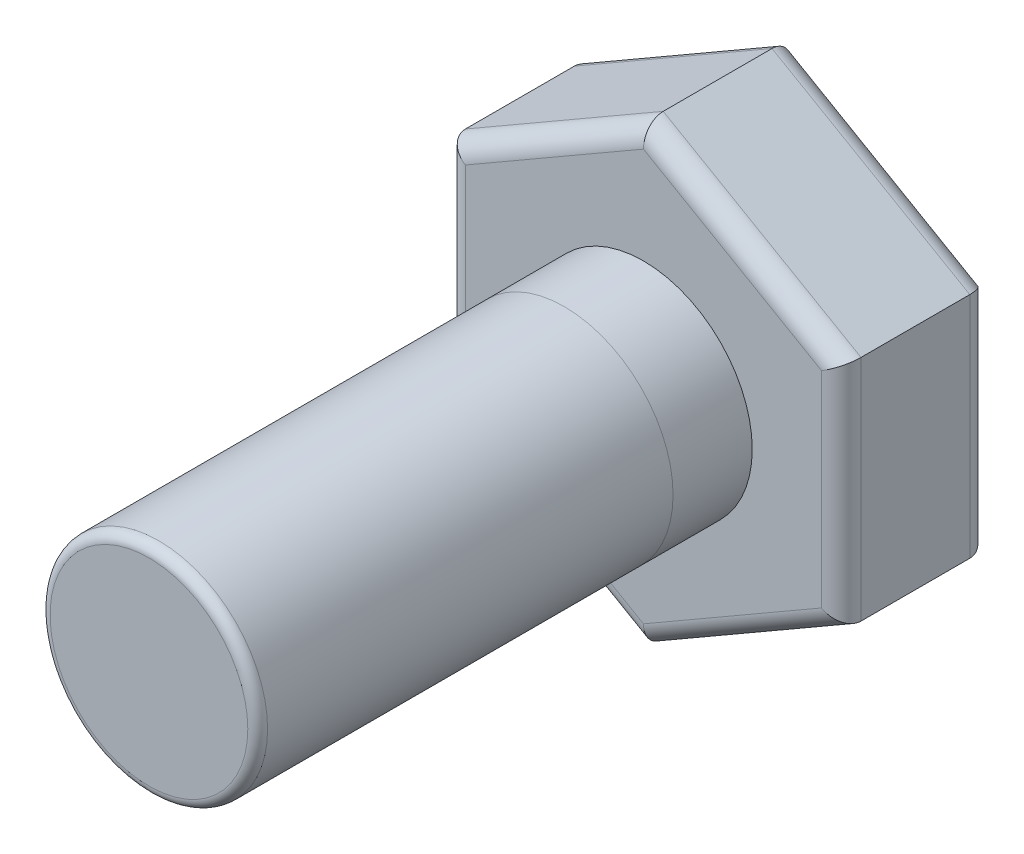
ISO-10303-21;
HEADER;
FILE_DESCRIPTION(('STEP AP214'),'2;1');
FILE_NAME('part.step','',(''),(''),'','','');
FILE_SCHEMA(('AUTOMOTIVE_DESIGN { 1 0 10303 214 1 1 1 1 }'));
ENDSEC;
DATA;
#1=APPLICATION_CONTEXT('core data for automotive mechanical design processes');
#2=APPLICATION_PROTOCOL_DEFINITION('international standard','automotive_design',2000,#1);
#3=PRODUCT_CONTEXT('',#1,'mechanical');
#4=PRODUCT('Part','Part','',(#3));
#5=PRODUCT_RELATED_PRODUCT_CATEGORY('part','',(#4));
#6=PRODUCT_DEFINITION_FORMATION('','',#4);
#7=PRODUCT_DEFINITION_CONTEXT('part definition',#1,'design');
#8=PRODUCT_DEFINITION('design','',#6,#7);
#9=PRODUCT_DEFINITION_SHAPE('','',#8);
#10=(LENGTH_UNIT() NAMED_UNIT(*) SI_UNIT(.MILLI.,.METRE.));
#11=(NAMED_UNIT(*) PLANE_ANGLE_UNIT() SI_UNIT($,.RADIAN.));
#12=(NAMED_UNIT(*) SI_UNIT($,.STERADIAN.) SOLID_ANGLE_UNIT());
#13=UNCERTAINTY_MEASURE_WITH_UNIT(LENGTH_MEASURE(1.E-05),#10,'distance_accuracy_value','');
#14=(GEOMETRIC_REPRESENTATION_CONTEXT(3) GLOBAL_UNCERTAINTY_ASSIGNED_CONTEXT((#13)) GLOBAL_UNIT_ASSIGNED_CONTEXT((#10,
#11,#12)) REPRESENTATION_CONTEXT('',''));
#15=CARTESIAN_POINT('',(0.,0.,0.));
#16=DIRECTION('',(0.,0.,1.));
#17=DIRECTION('',(1.,0.,0.));
#18=AXIS2_PLACEMENT_3D('',#15,#16,#17);
#19=CARTESIAN_POINT('',(20.,34.6410161513775,15.));
#20=DIRECTION('',(0.,0.,1.));
#21=DIRECTION('',(1.,0.,0.));
#22=AXIS2_PLACEMENT_3D('',#19,#20,#21);
#23=PLANE('',#22);
#24=DIRECTION('',(0.,-1.,0.));
#25=VECTOR('',#24,1.);
#26=CARTESIAN_POINT('',(-18.,-11.5470053837925,15.));
#27=LINE('',#26,#25);
#28=CARTESIAN_POINT('',(-18.,10.3923048454133,15.));
#29=VERTEX_POINT('',#28);
#30=CARTESIAN_POINT('',(-18.,-10.3923048454133,15.));
#31=VERTEX_POINT('',#30);
#32=EDGE_CURVE('E58',#29,#31,#27,.T.);
#33=ORIENTED_EDGE('',*,*,#32,.T.);
#34=DIRECTION('',(0.866025403784439,-0.5,0.));
#35=VECTOR('',#34,1.);
#36=CARTESIAN_POINT('',(1.,-21.3619599600162,15.));
#37=LINE('',#36,#35);
#38=CARTESIAN_POINT('',(0.,-20.7846096908265,15.));
#39=VERTEX_POINT('',#38);
#40=EDGE_CURVE('E416',#31,#39,#37,.T.);
#41=ORIENTED_EDGE('',*,*,#40,.T.);
#42=DIRECTION('',(0.866025403784439,0.5,0.));
#43=VECTOR('',#42,1.);
#44=CARTESIAN_POINT('',(19.,-9.81495457622365,15.));
#45=LINE('',#44,#43);
#46=CARTESIAN_POINT('',(18.,-10.3923048454133,15.));
#47=VERTEX_POINT('',#46);
#48=EDGE_CURVE('E417',#39,#47,#45,.T.);
#49=ORIENTED_EDGE('',*,*,#48,.T.);
#50=DIRECTION('',(0.,1.,0.));
#51=VECTOR('',#50,1.);
#52=CARTESIAN_POINT('',(18.,11.5470053837925,15.));
#53=LINE('',#52,#51);
#54=CARTESIAN_POINT('',(18.,10.3923048454133,15.));
#55=VERTEX_POINT('',#54);
#56=EDGE_CURVE('E448',#47,#55,#53,.T.);
#57=ORIENTED_EDGE('',*,*,#56,.T.);
#58=DIRECTION('',(-0.866025403784439,0.5,0.));
#59=VECTOR('',#58,1.);
#60=CARTESIAN_POINT('',(-0.999999999999994,21.3619599600162,15.));
#61=LINE('',#60,#59);
#62=CARTESIAN_POINT('',(0.,20.7846096908265,15.));
#63=VERTEX_POINT('',#62);
#64=EDGE_CURVE('E444',#55,#63,#61,.T.);
#65=ORIENTED_EDGE('',*,*,#64,.T.);
#66=DIRECTION('',(-0.866025403784439,-0.5,0.));
#67=VECTOR('',#66,1.);
#68=CARTESIAN_POINT('',(-19.,9.81495457622364,15.));
#69=LINE('',#68,#67);
#70=EDGE_CURVE('E164',#63,#29,#69,.T.);
#71=ORIENTED_EDGE('',*,*,#70,.T.);
#72=EDGE_LOOP('',(#33,#41,#49,#57,#65,#71));
#73=FACE_BOUND('',#72,.T.);
#74=CARTESIAN_POINT('',(0.,0.,15.));
#75=DIRECTION('',(0.,0.,1.));
#76=DIRECTION('',(1.,0.,0.));
#77=AXIS2_PLACEMENT_3D('',#74,#75,#76);
#78=CIRCLE('',#77,11.);
#79=CARTESIAN_POINT('',(11.,0.,15.));
#80=VERTEX_POINT('',#79);
#81=EDGE_CURVE('E435',#80,#80,#78,.T.);
#82=ORIENTED_EDGE('',*,*,#81,.F.);
#83=EDGE_LOOP('',(#82));
#84=FACE_BOUND('',#83,.T.);
#85=ADVANCED_FACE('F35',(#73,#84),#23,.T.);
#86=CARTESIAN_POINT('',(20.,-11.5470053837925,15.));
#87=DIRECTION('',(-1.,0.,0.));
#88=DIRECTION('',(0.,0.,1.));
#89=AXIS2_PLACEMENT_3D('',#86,#87,#88);
#90=PLANE('',#89);
#91=DIRECTION('',(0.,0.,-1.));
#92=VECTOR('',#91,1.);
#93=CARTESIAN_POINT('',(20.,-11.5470053837925,15.));
#94=LINE('',#93,#92);
#95=CARTESIAN_POINT('',(20.,-11.5470053837925,13.));
#96=VERTEX_POINT('',#95);
#97=CARTESIAN_POINT('',(20.,-11.5470053837925,2.));
#98=VERTEX_POINT('',#97);
#99=EDGE_CURVE('E487',#96,#98,#94,.T.);
#100=ORIENTED_EDGE('',*,*,#99,.T.);
#101=DIRECTION('',(0.,1.,0.));
#102=VECTOR('',#101,1.);
#103=CARTESIAN_POINT('',(20.,-11.5470053837925,2.));
#104=LINE('',#103,#102);
#105=CARTESIAN_POINT('',(20.,11.5470053837925,2.));
#106=VERTEX_POINT('',#105);
#107=EDGE_CURVE('E450',#98,#106,#104,.T.);
#108=ORIENTED_EDGE('',*,*,#107,.T.);
#109=DIRECTION('',(0.,0.,-1.));
#110=VECTOR('',#109,1.);
#111=CARTESIAN_POINT('',(20.,11.5470053837925,15.));
#112=LINE('',#111,#110);
#113=CARTESIAN_POINT('',(20.,11.5470053837925,13.));
#114=VERTEX_POINT('',#113);
#115=EDGE_CURVE('E150',#114,#106,#112,.T.);
#116=ORIENTED_EDGE('',*,*,#115,.F.);
#117=DIRECTION('',(0.,1.,0.));
#118=VECTOR('',#117,1.);
#119=CARTESIAN_POINT('',(20.,-11.5470053837925,13.));
#120=LINE('',#119,#118);
#121=EDGE_CURVE('E452',#114,#96,#120,.F.);
#122=ORIENTED_EDGE('',*,*,#121,.T.);
#123=EDGE_LOOP('',(#100,#108,#116,#122));
#124=FACE_BOUND('',#123,.T.);
#125=ADVANCED_FACE('F198',(#124),#90,.F.);
#126=CARTESIAN_POINT('',(20.,11.5470053837925,15.));
#127=DIRECTION('',(-0.5,-0.866025403784439,0.));
#128=DIRECTION('',(0.866025403784439,-0.5,0.));
#129=AXIS2_PLACEMENT_3D('',#126,#127,#128);
#130=PLANE('',#129);
#131=ORIENTED_EDGE('',*,*,#115,.T.);
#132=DIRECTION('',(-0.866025403784439,0.5,0.));
#133=VECTOR('',#132,1.);
#134=CARTESIAN_POINT('',(20.,11.5470053837925,2.));
#135=LINE('',#134,#133);
#136=CARTESIAN_POINT('',(0.,23.094010767585,2.));
#137=VERTEX_POINT('',#136);
#138=EDGE_CURVE('E149',#106,#137,#135,.T.);
#139=ORIENTED_EDGE('',*,*,#138,.T.);
#140=DIRECTION('',(0.,0.,-1.));
#141=VECTOR('',#140,1.);
#142=CARTESIAN_POINT('',(0.,23.094010767585,15.));
#143=LINE('',#142,#141);
#144=CARTESIAN_POINT('',(0.,23.094010767585,13.));
#145=VERTEX_POINT('',#144);
#146=EDGE_CURVE('E131',#145,#137,#143,.T.);
#147=ORIENTED_EDGE('',*,*,#146,.F.);
#148=DIRECTION('',(-0.866025403784439,0.5,0.));
#149=VECTOR('',#148,1.);
#150=CARTESIAN_POINT('',(20.,11.5470053837925,13.));
#151=LINE('',#150,#149);
#152=EDGE_CURVE('E146',#145,#114,#151,.F.);
#153=ORIENTED_EDGE('',*,*,#152,.T.);
#154=EDGE_LOOP('',(#131,#139,#147,#153));
#155=FACE_BOUND('',#154,.T.);
#156=ADVANCED_FACE('F145',(#155),#130,.F.);
#157=CARTESIAN_POINT('',(0.,23.094010767585,15.));
#158=DIRECTION('',(0.5,-0.866025403784439,0.));
#159=DIRECTION('',(0.866025403784439,0.5,0.));
#160=AXIS2_PLACEMENT_3D('',#157,#158,#159);
#161=PLANE('',#160);
#162=ORIENTED_EDGE('',*,*,#146,.T.);
#163=DIRECTION('',(-0.866025403784439,-0.5,0.));
#164=VECTOR('',#163,1.);
#165=CARTESIAN_POINT('',(0.,23.094010767585,2.));
#166=LINE('',#165,#164);
#167=CARTESIAN_POINT('',(-20.,11.5470053837925,2.));
#168=VERTEX_POINT('',#167);
#169=EDGE_CURVE('E138',#137,#168,#166,.T.);
#170=ORIENTED_EDGE('',*,*,#169,.T.);
#171=DIRECTION('',(0.,0.,-1.));
#172=VECTOR('',#171,1.);
#173=CARTESIAN_POINT('',(-20.,11.5470053837925,15.));
#174=LINE('',#173,#172);
#175=CARTESIAN_POINT('',(-20.,11.5470053837925,13.));
#176=VERTEX_POINT('',#175);
#177=EDGE_CURVE('E133',#176,#168,#174,.T.);
#178=ORIENTED_EDGE('',*,*,#177,.F.);
#179=DIRECTION('',(-0.866025403784439,-0.5,0.));
#180=VECTOR('',#179,1.);
#181=CARTESIAN_POINT('',(0.,23.094010767585,13.));
#182=LINE('',#181,#180);
#183=EDGE_CURVE('E128',#176,#145,#182,.F.);
#184=ORIENTED_EDGE('',*,*,#183,.T.);
#185=EDGE_LOOP('',(#162,#170,#178,#184));
#186=FACE_BOUND('',#185,.T.);
#187=ADVANCED_FACE('F130',(#186),#161,.F.);
#188=CARTESIAN_POINT('',(-20.,11.5470053837925,15.));
#189=DIRECTION('',(1.,0.,0.));
#190=DIRECTION('',(0.,0.,-1.));
#191=AXIS2_PLACEMENT_3D('',#188,#189,#190);
#192=PLANE('',#191);
#193=ORIENTED_EDGE('',*,*,#177,.T.);
#194=DIRECTION('',(0.,-1.,0.));
#195=VECTOR('',#194,1.);
#196=CARTESIAN_POINT('',(-20.,11.5470053837925,2.));
#197=LINE('',#196,#195);
#198=CARTESIAN_POINT('',(-20.,-11.5470053837925,2.));
#199=VERTEX_POINT('',#198);
#200=EDGE_CURVE('E462',#168,#199,#197,.T.);
#201=ORIENTED_EDGE('',*,*,#200,.T.);
#202=DIRECTION('',(0.,0.,-1.));
#203=VECTOR('',#202,1.);
#204=CARTESIAN_POINT('',(-20.,-11.5470053837925,15.));
#205=LINE('',#204,#203);
#206=CARTESIAN_POINT('',(-20.,-11.5470053837925,13.));
#207=VERTEX_POINT('',#206);
#208=EDGE_CURVE('E481',#207,#199,#205,.T.);
#209=ORIENTED_EDGE('',*,*,#208,.F.);
#210=DIRECTION('',(0.,-1.,0.));
#211=VECTOR('',#210,1.);
#212=CARTESIAN_POINT('',(-20.,11.5470053837925,13.));
#213=LINE('',#212,#211);
#214=EDGE_CURVE('E442',#207,#176,#213,.F.);
#215=ORIENTED_EDGE('',*,*,#214,.T.);
#216=EDGE_LOOP('',(#193,#201,#209,#215));
#217=FACE_BOUND('',#216,.T.);
#218=ADVANCED_FACE('F209',(#217),#192,.F.);
#219=CARTESIAN_POINT('',(-20.,-11.5470053837925,15.));
#220=DIRECTION('',(0.5,0.866025403784439,0.));
#221=DIRECTION('',(-0.866025403784439,0.5,0.));
#222=AXIS2_PLACEMENT_3D('',#219,#220,#221);
#223=PLANE('',#222);
#224=ORIENTED_EDGE('',*,*,#208,.T.);
#225=DIRECTION('',(0.866025403784439,-0.5,0.));
#226=VECTOR('',#225,1.);
#227=CARTESIAN_POINT('',(-20.,-11.5470053837925,2.));
#228=LINE('',#227,#226);
#229=CARTESIAN_POINT('',(0.,-23.094010767585,2.));
#230=VERTEX_POINT('',#229);
#231=EDGE_CURVE('E458',#199,#230,#228,.T.);
#232=ORIENTED_EDGE('',*,*,#231,.T.);
#233=DIRECTION('',(0.,0.,-1.));
#234=VECTOR('',#233,1.);
#235=CARTESIAN_POINT('',(0.,-23.094010767585,15.));
#236=LINE('',#235,#234);
#237=CARTESIAN_POINT('',(0.,-23.094010767585,13.));
#238=VERTEX_POINT('',#237);
#239=EDGE_CURVE('E484',#238,#230,#236,.T.);
#240=ORIENTED_EDGE('',*,*,#239,.F.);
#241=DIRECTION('',(0.866025403784439,-0.5,0.));
#242=VECTOR('',#241,1.);
#243=CARTESIAN_POINT('',(-20.,-11.5470053837925,13.));
#244=LINE('',#243,#242);
#245=EDGE_CURVE('E460',#238,#207,#244,.F.);
#246=ORIENTED_EDGE('',*,*,#245,.T.);
#247=EDGE_LOOP('',(#224,#232,#240,#246));
#248=FACE_BOUND('',#247,.T.);
#249=ADVANCED_FACE('F205',(#248),#223,.F.);
#250=CARTESIAN_POINT('',(0.,-23.094010767585,15.));
#251=DIRECTION('',(-0.5,0.866025403784439,0.));
#252=DIRECTION('',(-0.866025403784439,-0.5,0.));
#253=AXIS2_PLACEMENT_3D('',#250,#251,#252);
#254=PLANE('',#253);
#255=ORIENTED_EDGE('',*,*,#239,.T.);
#256=DIRECTION('',(0.866025403784439,0.5,0.));
#257=VECTOR('',#256,1.);
#258=CARTESIAN_POINT('',(0.,-23.094010767585,2.));
#259=LINE('',#258,#257);
#260=EDGE_CURVE('E454',#230,#98,#259,.T.);
#261=ORIENTED_EDGE('',*,*,#260,.T.);
#262=ORIENTED_EDGE('',*,*,#99,.F.);
#263=DIRECTION('',(0.866025403784439,0.5,0.));
#264=VECTOR('',#263,1.);
#265=CARTESIAN_POINT('',(0.,-23.094010767585,13.));
#266=LINE('',#265,#264);
#267=EDGE_CURVE('E456',#96,#238,#266,.F.);
#268=ORIENTED_EDGE('',*,*,#267,.T.);
#269=EDGE_LOOP('',(#255,#261,#262,#268));
#270=FACE_BOUND('',#269,.T.);
#271=ADVANCED_FACE('F201',(#270),#254,.F.);
#272=CARTESIAN_POINT('',(20.,34.6410161513775,0.));
#273=DIRECTION('',(0.,0.,1.));
#274=DIRECTION('',(1.,0.,0.));
#275=AXIS2_PLACEMENT_3D('',#272,#273,#274);
#276=PLANE('',#275);
#277=DIRECTION('',(-0.866025403784439,-0.5,0.));
#278=VECTOR('',#277,1.);
#279=CARTESIAN_POINT('',(21.,32.9089653438087,0.));
#280=LINE('',#279,#278);
#281=CARTESIAN_POINT('',(-18.,10.3923048454133,0.));
#282=VERTEX_POINT('',#281);
#283=CARTESIAN_POINT('',(0.,20.7846096908265,0.));
#284=VERTEX_POINT('',#283);
#285=EDGE_CURVE('E468',#282,#284,#280,.F.);
#286=ORIENTED_EDGE('',*,*,#285,.T.);
#287=DIRECTION('',(-0.866025403784439,0.5,0.));
#288=VECTOR('',#287,1.);
#289=CARTESIAN_POINT('',(9.00000000000001,15.5884572681199,0.));
#290=LINE('',#289,#288);
#291=CARTESIAN_POINT('',(18.,10.3923048454133,0.));
#292=VERTEX_POINT('',#291);
#293=EDGE_CURVE('E139',#284,#292,#290,.F.);
#294=ORIENTED_EDGE('',*,*,#293,.T.);
#295=DIRECTION('',(0.,1.,0.));
#296=VECTOR('',#295,1.);
#297=CARTESIAN_POINT('',(18.,34.6410161513775,0.));
#298=LINE('',#297,#296);
#299=CARTESIAN_POINT('',(18.,-10.3923048454133,0.));
#300=VERTEX_POINT('',#299);
#301=EDGE_CURVE('E476',#292,#300,#298,.F.);
#302=ORIENTED_EDGE('',*,*,#301,.T.);
#303=DIRECTION('',(0.866025403784439,0.5,0.));
#304=VECTOR('',#303,1.);
#305=CARTESIAN_POINT('',(39.,1.73205080756886,0.));
#306=LINE('',#305,#304);
#307=CARTESIAN_POINT('',(0.,-20.7846096908265,0.));
#308=VERTEX_POINT('',#307);
#309=EDGE_CURVE('E474',#300,#308,#306,.F.);
#310=ORIENTED_EDGE('',*,*,#309,.T.);
#311=DIRECTION('',(0.866025403784439,-0.5,0.));
#312=VECTOR('',#311,1.);
#313=CARTESIAN_POINT('',(-9.,-15.5884572681199,0.));
#314=LINE('',#313,#312);
#315=CARTESIAN_POINT('',(-18.,-10.3923048454133,0.));
#316=VERTEX_POINT('',#315);
#317=EDGE_CURVE('E472',#308,#316,#314,.F.);
#318=ORIENTED_EDGE('',*,*,#317,.T.);
#319=DIRECTION('',(0.,-1.,0.));
#320=VECTOR('',#319,1.);
#321=CARTESIAN_POINT('',(-18.,34.6410161513775,0.));
#322=LINE('',#321,#320);
#323=EDGE_CURVE('E470',#316,#282,#322,.F.);
#324=ORIENTED_EDGE('',*,*,#323,.T.);
#325=EDGE_LOOP('',(#286,#294,#302,#310,#318,#324));
#326=FACE_BOUND('',#325,.T.);
#327=ADVANCED_FACE('F192',(#326),#276,.F.);
#328=CARTESIAN_POINT('',(0.,0.,23.));
#329=DIRECTION('',(0.,0.,-1.));
#330=DIRECTION('',(-1.,0.,0.));
#331=AXIS2_PLACEMENT_3D('',#328,#329,#330);
#332=CYLINDRICAL_SURFACE('',#331,11.);
#333=CARTESIAN_POINT('',(0.,0.,23.));
#334=DIRECTION('',(0.,0.,1.));
#335=DIRECTION('',(1.,0.,0.));
#336=AXIS2_PLACEMENT_3D('',#333,#334,#335);
#337=CIRCLE('',#336,10.995);
#338=CARTESIAN_POINT('',(10.995,0.,23.));
#339=VERTEX_POINT('',#338);
#340=EDGE_CURVE('E177',#339,#339,#337,.T.);
#341=ORIENTED_EDGE('',*,*,#340,.F.);
#342=EDGE_LOOP('',(#341));
#343=FACE_BOUND('',#342,.T.);
#344=ORIENTED_EDGE('',*,*,#81,.T.);
#345=EDGE_LOOP('',(#344));
#346=FACE_BOUND('',#345,.T.);
#347=ADVANCED_FACE('F181',(#343,#346),#332,.T.);
#348=CARTESIAN_POINT('',(-19.,-9.81495457622364,2.));
#349=DIRECTION('',(0.866025403784439,-0.5,0.));
#350=DIRECTION('',(0.5,0.866025403784439,0.));
#351=AXIS2_PLACEMENT_3D('',#348,#349,#350);
#352=CYLINDRICAL_SURFACE('',#351,2.);
#353=CARTESIAN_POINT('',(-18.,-10.3923048454133,2.));
#354=DIRECTION('',(0.5,-0.866025403784439,0.));
#355=DIRECTION('',(0.866025403784439,0.5,0.));
#356=AXIS2_PLACEMENT_3D('',#353,#354,#355);
#357=ELLIPSE('',#356,2.3094010767585,2.);
#358=EDGE_CURVE('E429',#316,#199,#357,.F.);
#359=ORIENTED_EDGE('',*,*,#358,.F.);
#360=ORIENTED_EDGE('',*,*,#317,.F.);
#361=CARTESIAN_POINT('',(0.,-20.7846096908265,2.));
#362=DIRECTION('',(1.,0.,0.));
#363=DIRECTION('',(0.,1.,0.));
#364=AXIS2_PLACEMENT_3D('',#361,#362,#363);
#365=ELLIPSE('',#364,2.3094010767585,2.);
#366=EDGE_CURVE('E432',#230,#308,#365,.T.);
#367=ORIENTED_EDGE('',*,*,#366,.F.);
#368=ORIENTED_EDGE('',*,*,#231,.F.);
#369=EDGE_LOOP('',(#359,#360,#367,#368));
#370=FACE_BOUND('',#369,.T.);
#371=ADVANCED_FACE('F191',(#370),#352,.T.);
#372=CARTESIAN_POINT('',(-0.999999999999991,-21.3619599600162,2.));
#373=DIRECTION('',(0.866025403784439,0.5,0.));
#374=DIRECTION('',(-0.5,0.866025403784439,0.));
#375=AXIS2_PLACEMENT_3D('',#372,#373,#374);
#376=CYLINDRICAL_SURFACE('',#375,2.);
#377=ORIENTED_EDGE('',*,*,#366,.T.);
#378=ORIENTED_EDGE('',*,*,#309,.F.);
#379=CARTESIAN_POINT('',(18.,-10.3923048454133,2.));
#380=DIRECTION('',(0.5,0.866025403784439,0.));
#381=DIRECTION('',(-0.866025403784439,0.5,0.));
#382=AXIS2_PLACEMENT_3D('',#379,#380,#381);
#383=ELLIPSE('',#382,2.3094010767585,2.);
#384=EDGE_CURVE('E426',#98,#300,#383,.T.);
#385=ORIENTED_EDGE('',*,*,#384,.F.);
#386=ORIENTED_EDGE('',*,*,#260,.F.);
#387=EDGE_LOOP('',(#377,#378,#385,#386));
#388=FACE_BOUND('',#387,.T.);
#389=ADVANCED_FACE('F236',(#388),#376,.T.);
#390=CARTESIAN_POINT('',(-18.,11.5470053837925,2.));
#391=DIRECTION('',(0.,-1.,0.));
#392=DIRECTION('',(0.,0.,-1.));
#393=AXIS2_PLACEMENT_3D('',#390,#391,#392);
#394=CYLINDRICAL_SURFACE('',#393,2.);
#395=ORIENTED_EDGE('',*,*,#358,.T.);
#396=ORIENTED_EDGE('',*,*,#200,.F.);
#397=CARTESIAN_POINT('',(-18.,10.3923048454133,2.));
#398=DIRECTION('',(-0.5,-0.866025403784439,0.));
#399=DIRECTION('',(0.866025403784439,-0.5,0.));
#400=AXIS2_PLACEMENT_3D('',#397,#398,#399);
#401=ELLIPSE('',#400,2.3094010767585,2.);
#402=EDGE_CURVE('E423',#282,#168,#401,.F.);
#403=ORIENTED_EDGE('',*,*,#402,.F.);
#404=ORIENTED_EDGE('',*,*,#323,.F.);
#405=EDGE_LOOP('',(#395,#396,#403,#404));
#406=FACE_BOUND('',#405,.T.);
#407=ADVANCED_FACE('F232',(#406),#394,.T.);
#408=CARTESIAN_POINT('',(18.,-11.5470053837925,2.));
#409=DIRECTION('',(0.,1.,0.));
#410=DIRECTION('',(0.,0.,1.));
#411=AXIS2_PLACEMENT_3D('',#408,#409,#410);
#412=CYLINDRICAL_SURFACE('',#411,2.);
#413=ORIENTED_EDGE('',*,*,#384,.T.);
#414=ORIENTED_EDGE('',*,*,#301,.F.);
#415=CARTESIAN_POINT('',(18.,10.3923048454133,2.));
#416=DIRECTION('',(-0.5,0.866025403784439,0.));
#417=DIRECTION('',(0.866025403784439,0.5,0.));
#418=AXIS2_PLACEMENT_3D('',#415,#416,#417);
#419=ELLIPSE('',#418,2.3094010767585,2.);
#420=EDGE_CURVE('E167',#106,#292,#419,.T.);
#421=ORIENTED_EDGE('',*,*,#420,.F.);
#422=ORIENTED_EDGE('',*,*,#107,.F.);
#423=EDGE_LOOP('',(#413,#414,#421,#422));
#424=FACE_BOUND('',#423,.T.);
#425=ADVANCED_FACE('F228',(#424),#412,.T.);
#426=CARTESIAN_POINT('',(1.00000000000001,21.3619599600162,2.));
#427=DIRECTION('',(-0.866025403784439,-0.5,0.));
#428=DIRECTION('',(0.5,-0.866025403784439,0.));
#429=AXIS2_PLACEMENT_3D('',#426,#427,#428);
#430=CYLINDRICAL_SURFACE('',#429,2.);
#431=ORIENTED_EDGE('',*,*,#402,.T.);
#432=ORIENTED_EDGE('',*,*,#169,.F.);
#433=CARTESIAN_POINT('',(0.,20.7846096908265,2.));
#434=DIRECTION('',(-1.,0.,0.));
#435=DIRECTION('',(0.,-1.,0.));
#436=AXIS2_PLACEMENT_3D('',#433,#434,#435);
#437=ELLIPSE('',#436,2.3094010767585,2.);
#438=EDGE_CURVE('E165',#284,#137,#437,.F.);
#439=ORIENTED_EDGE('',*,*,#438,.F.);
#440=ORIENTED_EDGE('',*,*,#285,.F.);
#441=EDGE_LOOP('',(#431,#432,#439,#440));
#442=FACE_BOUND('',#441,.T.);
#443=ADVANCED_FACE('F224',(#442),#430,.T.);
#444=CARTESIAN_POINT('',(19.,9.81495457622364,2.));
#445=DIRECTION('',(-0.866025403784439,0.5,0.));
#446=DIRECTION('',(-0.5,-0.866025403784439,0.));
#447=AXIS2_PLACEMENT_3D('',#444,#445,#446);
#448=CYLINDRICAL_SURFACE('',#447,2.);
#449=ORIENTED_EDGE('',*,*,#420,.T.);
#450=ORIENTED_EDGE('',*,*,#293,.F.);
#451=ORIENTED_EDGE('',*,*,#438,.T.);
#452=ORIENTED_EDGE('',*,*,#138,.F.);
#453=EDGE_LOOP('',(#449,#450,#451,#452));
#454=FACE_BOUND('',#453,.T.);
#455=ADVANCED_FACE('F221',(#454),#448,.T.);
#456=CARTESIAN_POINT('',(9.00000000000001,15.5884572681199,13.));
#457=DIRECTION('',(0.866025403784439,-0.5,0.));
#458=DIRECTION('',(0.5,0.866025403784439,0.));
#459=AXIS2_PLACEMENT_3D('',#456,#457,#458);
#460=CYLINDRICAL_SURFACE('',#459,2.);
#461=CARTESIAN_POINT('',(18.,10.3923048454133,13.));
#462=DIRECTION('',(0.5,-0.866025403784439,0.));
#463=DIRECTION('',(-0.866025403784439,-0.5,0.));
#464=AXIS2_PLACEMENT_3D('',#461,#462,#463);
#465=ELLIPSE('',#464,2.3094010767585,2.);
#466=EDGE_CURVE('E160',#114,#55,#465,.T.);
#467=ORIENTED_EDGE('',*,*,#466,.F.);
#468=ORIENTED_EDGE('',*,*,#152,.F.);
#469=CARTESIAN_POINT('',(0.,20.7846096908265,13.));
#470=DIRECTION('',(1.,0.,0.));
#471=DIRECTION('',(0.,-1.,0.));
#472=AXIS2_PLACEMENT_3D('',#469,#470,#471);
#473=ELLIPSE('',#472,2.3094010767585,2.);
#474=EDGE_CURVE('E157',#63,#145,#473,.F.);
#475=ORIENTED_EDGE('',*,*,#474,.F.);
#476=ORIENTED_EDGE('',*,*,#64,.F.);
#477=EDGE_LOOP('',(#467,#468,#475,#476));
#478=FACE_BOUND('',#477,.T.);
#479=ADVANCED_FACE('F155',(#478),#460,.T.);
#480=CARTESIAN_POINT('',(21.,32.9089653438087,13.));
#481=DIRECTION('',(0.866025403784439,0.5,0.));
#482=DIRECTION('',(-0.5,0.866025403784439,0.));
#483=AXIS2_PLACEMENT_3D('',#480,#481,#482);
#484=CYLINDRICAL_SURFACE('',#483,2.);
#485=ORIENTED_EDGE('',*,*,#474,.T.);
#486=ORIENTED_EDGE('',*,*,#183,.F.);
#487=CARTESIAN_POINT('',(-18.,10.3923048454133,13.));
#488=DIRECTION('',(0.5,0.866025403784439,0.));
#489=DIRECTION('',(0.866025403784439,-0.5,0.));
#490=AXIS2_PLACEMENT_3D('',#487,#488,#489);
#491=ELLIPSE('',#490,2.3094010767585,2.);
#492=EDGE_CURVE('E169',#29,#176,#491,.F.);
#493=ORIENTED_EDGE('',*,*,#492,.F.);
#494=ORIENTED_EDGE('',*,*,#70,.F.);
#495=EDGE_LOOP('',(#485,#486,#493,#494));
#496=FACE_BOUND('',#495,.T.);
#497=ADVANCED_FACE('F163',(#496),#484,.T.);
#498=CARTESIAN_POINT('',(18.,34.6410161513775,13.));
#499=DIRECTION('',(0.,-1.,0.));
#500=DIRECTION('',(0.,0.,-1.));
#501=AXIS2_PLACEMENT_3D('',#498,#499,#500);
#502=CYLINDRICAL_SURFACE('',#501,2.);
#503=ORIENTED_EDGE('',*,*,#466,.T.);
#504=ORIENTED_EDGE('',*,*,#56,.F.);
#505=CARTESIAN_POINT('',(18.,-10.3923048454133,13.));
#506=DIRECTION('',(-0.5,-0.866025403784439,0.));
#507=DIRECTION('',(0.866025403784439,-0.5,0.));
#508=AXIS2_PLACEMENT_3D('',#505,#506,#507);
#509=ELLIPSE('',#508,2.3094010767585,2.);
#510=EDGE_CURVE('E439',#96,#47,#509,.T.);
#511=ORIENTED_EDGE('',*,*,#510,.F.);
#512=ORIENTED_EDGE('',*,*,#121,.F.);
#513=EDGE_LOOP('',(#503,#504,#511,#512));
#514=FACE_BOUND('',#513,.T.);
#515=ADVANCED_FACE('F254',(#514),#502,.T.);
#516=CARTESIAN_POINT('',(-18.,34.6410161513775,13.));
#517=DIRECTION('',(0.,1.,0.));
#518=DIRECTION('',(0.,0.,1.));
#519=AXIS2_PLACEMENT_3D('',#516,#517,#518);
#520=CYLINDRICAL_SURFACE('',#519,2.);
#521=ORIENTED_EDGE('',*,*,#492,.T.);
#522=ORIENTED_EDGE('',*,*,#214,.F.);
#523=CARTESIAN_POINT('',(-18.,-10.3923048454133,13.));
#524=DIRECTION('',(-0.5,0.866025403784439,0.));
#525=DIRECTION('',(0.866025403784439,0.5,0.));
#526=AXIS2_PLACEMENT_3D('',#523,#524,#525);
#527=ELLIPSE('',#526,2.3094010767585,2.);
#528=EDGE_CURVE('E437',#31,#207,#527,.F.);
#529=ORIENTED_EDGE('',*,*,#528,.F.);
#530=ORIENTED_EDGE('',*,*,#32,.F.);
#531=EDGE_LOOP('',(#521,#522,#529,#530));
#532=FACE_BOUND('',#531,.T.);
#533=ADVANCED_FACE('F250',(#532),#520,.T.);
#534=CARTESIAN_POINT('',(39.,1.73205080756886,13.));
#535=DIRECTION('',(-0.866025403784439,-0.5,0.));
#536=DIRECTION('',(0.5,-0.866025403784439,0.));
#537=AXIS2_PLACEMENT_3D('',#534,#535,#536);
#538=CYLINDRICAL_SURFACE('',#537,2.);
#539=ORIENTED_EDGE('',*,*,#510,.T.);
#540=ORIENTED_EDGE('',*,*,#48,.F.);
#541=CARTESIAN_POINT('',(0.,-20.7846096908265,13.));
#542=DIRECTION('',(-1.,0.,0.));
#543=DIRECTION('',(0.,-1.,0.));
#544=AXIS2_PLACEMENT_3D('',#541,#542,#543);
#545=ELLIPSE('',#544,2.3094010767585,2.);
#546=EDGE_CURVE('E50',#238,#39,#545,.T.);
#547=ORIENTED_EDGE('',*,*,#546,.F.);
#548=ORIENTED_EDGE('',*,*,#267,.F.);
#549=EDGE_LOOP('',(#539,#540,#547,#548));
#550=FACE_BOUND('',#549,.T.);
#551=ADVANCED_FACE('F247',(#550),#538,.T.);
#552=CARTESIAN_POINT('',(-9.,-15.5884572681199,13.));
#553=DIRECTION('',(-0.866025403784439,0.5,0.));
#554=DIRECTION('',(-0.5,-0.866025403784439,0.));
#555=AXIS2_PLACEMENT_3D('',#552,#553,#554);
#556=CYLINDRICAL_SURFACE('',#555,2.);
#557=ORIENTED_EDGE('',*,*,#528,.T.);
#558=ORIENTED_EDGE('',*,*,#245,.F.);
#559=ORIENTED_EDGE('',*,*,#546,.T.);
#560=ORIENTED_EDGE('',*,*,#40,.F.);
#561=EDGE_LOOP('',(#557,#558,#559,#560));
#562=FACE_BOUND('',#561,.T.);
#563=ADVANCED_FACE('F244',(#562),#556,.T.);
#564=CARTESIAN_POINT('',(0.,0.,65.));
#565=DIRECTION('',(0.,0.,-1.));
#566=DIRECTION('',(-1.,0.,0.));
#567=AXIS2_PLACEMENT_3D('',#564,#565,#566);
#568=CYLINDRICAL_SURFACE('',#567,10.995);
#569=CARTESIAN_POINT('',(0.,0.,64.));
#570=DIRECTION('',(0.,0.,1.));
#571=DIRECTION('',(1.,0.,0.));
#572=AXIS2_PLACEMENT_3D('',#569,#570,#571);
#573=CIRCLE('',#572,10.995);
#574=CARTESIAN_POINT('',(10.995,0.,64.));
#575=VERTEX_POINT('',#574);
#576=EDGE_CURVE('E11',#575,#575,#573,.F.);
#577=ORIENTED_EDGE('',*,*,#576,.T.);
#578=EDGE_LOOP('',(#577));
#579=FACE_BOUND('',#578,.T.);
#580=ORIENTED_EDGE('',*,*,#340,.T.);
#581=EDGE_LOOP('',(#580));
#582=FACE_BOUND('',#581,.T.);
#583=ADVANCED_FACE('F193',(#579,#582),#568,.T.);
#584=CARTESIAN_POINT('',(0.,0.,65.));
#585=DIRECTION('',(0.,0.,1.));
#586=DIRECTION('',(1.,0.,0.));
#587=AXIS2_PLACEMENT_3D('',#584,#585,#586);
#588=PLANE('',#587);
#589=CARTESIAN_POINT('',(0.,0.,65.));
#590=DIRECTION('',(0.,0.,1.));
#591=DIRECTION('',(1.,0.,0.));
#592=AXIS2_PLACEMENT_3D('',#589,#590,#591);
#593=CIRCLE('',#592,9.995);
#594=CARTESIAN_POINT('',(9.995,0.,65.));
#595=VERTEX_POINT('',#594);
#596=EDGE_CURVE('E43',#595,#595,#593,.T.);
#597=ORIENTED_EDGE('',*,*,#596,.T.);
#598=EDGE_LOOP('',(#597));
#599=FACE_BOUND('',#598,.T.);
#600=ADVANCED_FACE('F292',(#599),#588,.T.);
#601=CARTESIAN_POINT('',(0.,0.,64.));
#602=DIRECTION('',(0.,0.,1.));
#603=DIRECTION('',(1.,0.,0.));
#604=AXIS2_PLACEMENT_3D('',#601,#602,#603);
#605=TOROIDAL_SURFACE('',#604,9.995,1.);
#606=ORIENTED_EDGE('',*,*,#576,.F.);
#607=EDGE_LOOP('',(#606));
#608=FACE_BOUND('',#607,.T.);
#609=ORIENTED_EDGE('',*,*,#596,.F.);
#610=EDGE_LOOP('',(#609));
#611=FACE_BOUND('',#610,.T.);
#612=ADVANCED_FACE('F37',(#608,#611),#605,.T.);
#613=CLOSED_SHELL('',(#85,#125,#156,#187,#218,#249,#271,#327,#347,#371,#389,#407,#425,#443,#455,
#479,#497,#515,#533,#551,#563,#583,#600,#612));
#614=MANIFOLD_SOLID_BREP('B2',#613);
#615=ADVANCED_BREP_SHAPE_REPRESENTATION('',(#18,#614),#14);
#616=SHAPE_DEFINITION_REPRESENTATION(#9,#615);
ENDSEC;
END-ISO-10303-21;
